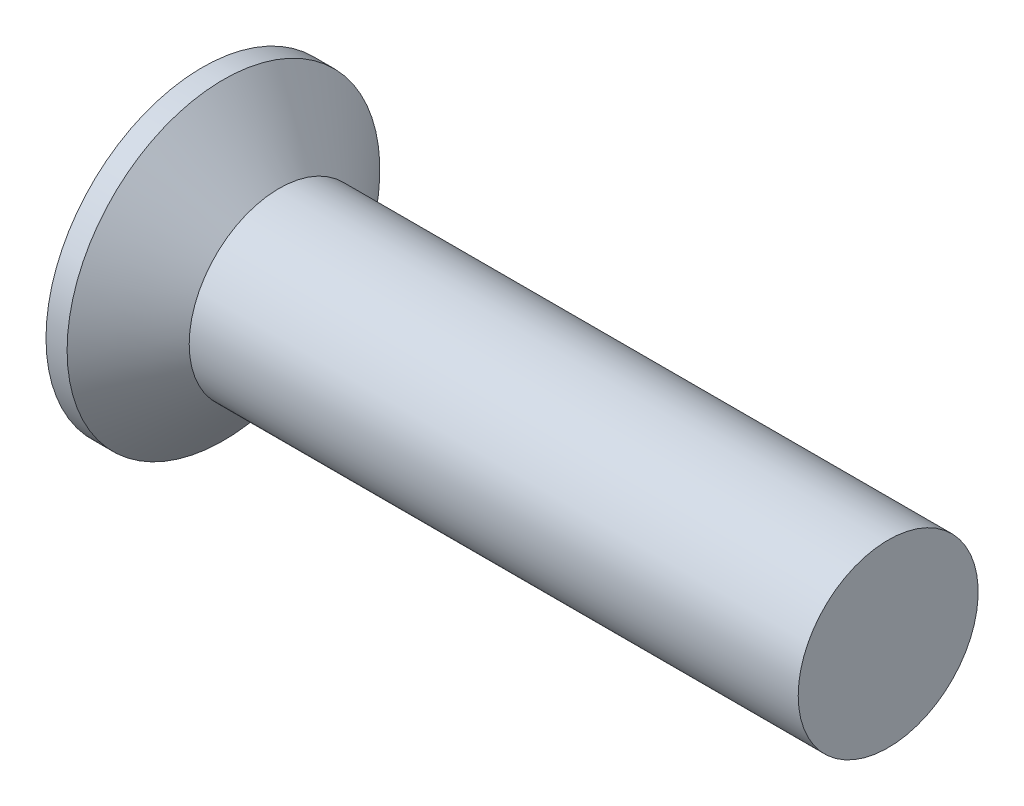
ISO-10303-21;
HEADER;
FILE_DESCRIPTION(('STEP AP214'),'2;1');
FILE_NAME('part.step','',(''),(''),'','','');
FILE_SCHEMA(('AUTOMOTIVE_DESIGN { 1 0 10303 214 1 1 1 1 }'));
ENDSEC;
DATA;
#1=APPLICATION_CONTEXT('core data for automotive mechanical design processes');
#2=APPLICATION_PROTOCOL_DEFINITION('international standard','automotive_design',2000,#1);
#3=PRODUCT_CONTEXT('',#1,'mechanical');
#4=PRODUCT('Part','Part','',(#3));
#5=PRODUCT_RELATED_PRODUCT_CATEGORY('part','',(#4));
#6=PRODUCT_DEFINITION_FORMATION('','',#4);
#7=PRODUCT_DEFINITION_CONTEXT('part definition',#1,'design');
#8=PRODUCT_DEFINITION('design','',#6,#7);
#9=PRODUCT_DEFINITION_SHAPE('','',#8);
#10=(LENGTH_UNIT() NAMED_UNIT(*) SI_UNIT(.MILLI.,.METRE.));
#11=(NAMED_UNIT(*) PLANE_ANGLE_UNIT() SI_UNIT($,.RADIAN.));
#12=(NAMED_UNIT(*) SI_UNIT($,.STERADIAN.) SOLID_ANGLE_UNIT());
#13=UNCERTAINTY_MEASURE_WITH_UNIT(LENGTH_MEASURE(1.E-05),#10,'distance_accuracy_value','');
#14=(GEOMETRIC_REPRESENTATION_CONTEXT(3) GLOBAL_UNCERTAINTY_ASSIGNED_CONTEXT((#13)) GLOBAL_UNIT_ASSIGNED_CONTEXT((#10,
#11,#12)) REPRESENTATION_CONTEXT('',''));
#15=CARTESIAN_POINT('',(0.,0.,0.));
#16=DIRECTION('',(0.,0.,1.));
#17=DIRECTION('',(1.,0.,0.));
#18=AXIS2_PLACEMENT_3D('',#15,#16,#17);
#19=CARTESIAN_POINT('',(0.,0.,0.));
#20=DIRECTION('',(-1.,0.,0.));
#21=DIRECTION('',(0.,0.,1.));
#22=AXIS2_PLACEMENT_3D('',#19,#20,#21);
#23=PLANE('',#22);
#24=CARTESIAN_POINT('',(0.,0.,0.));
#25=DIRECTION('',(-1.,0.,0.));
#26=DIRECTION('',(0.,0.,1.));
#27=AXIS2_PLACEMENT_3D('',#24,#25,#26);
#28=CIRCLE('',#27,3.6195);
#29=CARTESIAN_POINT('',(0.,0.,3.6195));
#30=VERTEX_POINT('',#29);
#31=EDGE_CURVE('E41',#30,#30,#28,.T.);
#32=ORIENTED_EDGE('',*,*,#31,.T.);
#33=EDGE_LOOP('',(#32));
#34=FACE_BOUND('',#33,.T.);
#35=DIRECTION('',(0.,1.,0.));
#36=VECTOR('',#35,1.);
#37=CARTESIAN_POINT('',(0.,-2.4257,-0.469899999999999));
#38=LINE('',#37,#36);
#39=CARTESIAN_POINT('',(0.,-2.4257,-0.469899999999999));
#40=VERTEX_POINT('',#39);
#41=CARTESIAN_POINT('',(0.,-0.469899999999998,-0.469899999999999));
#42=VERTEX_POINT('',#41);
#43=EDGE_CURVE('E102',#40,#42,#38,.T.);
#44=ORIENTED_EDGE('',*,*,#43,.T.);
#45=DIRECTION('',(0.,0.,-1.));
#46=VECTOR('',#45,1.);
#47=CARTESIAN_POINT('',(0.,-0.469900000000008,2.4257));
#48=LINE('',#47,#46);
#49=CARTESIAN_POINT('',(0.,-0.469899999999992,-2.4257));
#50=VERTEX_POINT('',#49);
#51=EDGE_CURVE('E82',#42,#50,#48,.T.);
#52=ORIENTED_EDGE('',*,*,#51,.T.);
#53=DIRECTION('',(0.,1.,0.));
#54=VECTOR('',#53,1.);
#55=CARTESIAN_POINT('',(0.,-0.469899999999992,-2.4257));
#56=LINE('',#55,#54);
#57=CARTESIAN_POINT('',(0.,0.469900000000008,-2.4257));
#58=VERTEX_POINT('',#57);
#59=EDGE_CURVE('E337',#50,#58,#56,.T.);
#60=ORIENTED_EDGE('',*,*,#59,.T.);
#61=DIRECTION('',(0.,0.,1.));
#62=VECTOR('',#61,1.);
#63=CARTESIAN_POINT('',(0.,0.469900000000008,-2.4257));
#64=LINE('',#63,#62);
#65=CARTESIAN_POINT('',(0.,0.469900000000001,-0.469899999999999));
#66=VERTEX_POINT('',#65);
#67=EDGE_CURVE('E98',#58,#66,#64,.T.);
#68=ORIENTED_EDGE('',*,*,#67,.T.);
#69=CARTESIAN_POINT('',(0.,2.4257,-0.469899999999999));
#70=VERTEX_POINT('',#69);
#71=EDGE_CURVE('E92',#66,#70,#38,.T.);
#72=ORIENTED_EDGE('',*,*,#71,.T.);
#73=DIRECTION('',(0.,0.,1.));
#74=VECTOR('',#73,1.);
#75=CARTESIAN_POINT('',(0.,2.4257,-0.469899999999999));
#76=LINE('',#75,#74);
#77=CARTESIAN_POINT('',(0.,2.4257,0.4699));
#78=VERTEX_POINT('',#77);
#79=EDGE_CURVE('E95',#70,#78,#76,.T.);
#80=ORIENTED_EDGE('',*,*,#79,.T.);
#81=DIRECTION('',(0.,-1.,0.));
#82=VECTOR('',#81,1.);
#83=CARTESIAN_POINT('',(0.,2.4257,0.4699));
#84=LINE('',#83,#82);
#85=CARTESIAN_POINT('',(0.,0.469899999999998,0.4699));
#86=VERTEX_POINT('',#85);
#87=EDGE_CURVE('E349',#78,#86,#84,.T.);
#88=ORIENTED_EDGE('',*,*,#87,.T.);
#89=CARTESIAN_POINT('',(0.,0.469899999999991,2.4257));
#90=VERTEX_POINT('',#89);
#91=EDGE_CURVE('E332',#86,#90,#64,.T.);
#92=ORIENTED_EDGE('',*,*,#91,.T.);
#93=DIRECTION('',(0.,-1.,0.));
#94=VECTOR('',#93,1.);
#95=CARTESIAN_POINT('',(0.,0.469899999999991,2.4257));
#96=LINE('',#95,#94);
#97=CARTESIAN_POINT('',(0.,-0.469900000000008,2.4257));
#98=VERTEX_POINT('',#97);
#99=EDGE_CURVE('E318',#90,#98,#96,.T.);
#100=ORIENTED_EDGE('',*,*,#99,.T.);
#101=CARTESIAN_POINT('',(0.,-0.469900000000001,0.4699));
#102=VERTEX_POINT('',#101);
#103=EDGE_CURVE('E330',#98,#102,#48,.T.);
#104=ORIENTED_EDGE('',*,*,#103,.T.);
#105=CARTESIAN_POINT('',(0.,-2.4257,0.4699));
#106=VERTEX_POINT('',#105);
#107=EDGE_CURVE('E108',#102,#106,#84,.T.);
#108=ORIENTED_EDGE('',*,*,#107,.T.);
#109=DIRECTION('',(0.,0.,-1.));
#110=VECTOR('',#109,1.);
#111=CARTESIAN_POINT('',(0.,-2.4257,0.4699));
#112=LINE('',#111,#110);
#113=EDGE_CURVE('E131',#106,#40,#112,.T.);
#114=ORIENTED_EDGE('',*,*,#113,.T.);
#115=EDGE_LOOP('',(#44,#52,#60,#68,#72,#80,#88,#92,#100,#104,#108,#114));
#116=FACE_BOUND('',#115,.T.);
#117=ADVANCED_FACE('F34',(#34,#116),#23,.T.);
#118=CARTESIAN_POINT('',(3.4873831884058,0.,0.209752463768116));
#119=DIRECTION('',(-0.0743900828817244,0.,-0.997229219171225));
#120=DIRECTION('',(-0.997229219171225,0.,0.0743900828817244));
#121=AXIS2_PLACEMENT_3D('',#118,#119,#120);
#122=PLANE('',#121);
#123=ORIENTED_EDGE('',*,*,#107,.F.);
#124=DIRECTION('',(0.994481343122547,0.0741851001926096,-0.0741851001926093));
#125=VECTOR('',#124,1.);
#126=CARTESIAN_POINT('',(3.50285782284413,-0.208598105957193,0.208598105957192));
#127=LINE('',#126,#125);
#128=CARTESIAN_POINT('',(3.1496,-0.234950000000001,0.23495));
#129=VERTEX_POINT('',#128);
#130=EDGE_CURVE('E126',#102,#129,#127,.T.);
#131=ORIENTED_EDGE('',*,*,#130,.T.);
#132=DIRECTION('',(0.81940388281906,0.56994826526729,-0.0611248864199703));
#133=VECTOR('',#132,1.);
#134=CARTESIAN_POINT('',(0.,-2.4257,0.4699));
#135=LINE('',#134,#133);
#136=EDGE_CURVE('E103',#106,#129,#135,.T.);
#137=ORIENTED_EDGE('',*,*,#136,.F.);
#138=EDGE_LOOP('',(#123,#131,#137));
#139=FACE_BOUND('',#138,.T.);
#140=ADVANCED_FACE('F154',(#139),#122,.T.);
#141=DIRECTION('',(0.81940388281906,-0.56994826526729,-0.0611248864199702));
#142=VECTOR('',#141,1.);
#143=CARTESIAN_POINT('',(0.,2.4257,0.4699));
#144=LINE('',#143,#142);
#145=CARTESIAN_POINT('',(3.1496,0.23495,0.23495));
#146=VERTEX_POINT('',#145);
#147=EDGE_CURVE('E48',#78,#146,#144,.T.);
#148=ORIENTED_EDGE('',*,*,#147,.T.);
#149=DIRECTION('',(-0.994481343122547,0.0741851001926089,0.0741851001926093));
#150=VECTOR('',#149,1.);
#151=CARTESIAN_POINT('',(3.50285782284413,0.208598105957191,0.208598105957192));
#152=LINE('',#151,#150);
#153=EDGE_CURVE('E345',#146,#86,#152,.T.);
#154=ORIENTED_EDGE('',*,*,#153,.T.);
#155=ORIENTED_EDGE('',*,*,#87,.F.);
#156=EDGE_LOOP('',(#148,#154,#155));
#157=FACE_BOUND('',#156,.T.);
#158=ADVANCED_FACE('F158',(#157),#122,.T.);
#159=CARTESIAN_POINT('',(3.4873831884058,0.,-0.209752463768116));
#160=DIRECTION('',(-0.0743900828817242,0.,0.997229219171224));
#161=DIRECTION('',(0.997229219171225,0.,0.0743900828817242));
#162=AXIS2_PLACEMENT_3D('',#159,#160,#161);
#163=PLANE('',#162);
#164=DIRECTION('',(0.819403882819061,0.56994826526729,0.0611248864199701));
#165=VECTOR('',#164,1.);
#166=CARTESIAN_POINT('',(0.,-2.4257,-0.469899999999999));
#167=LINE('',#166,#165);
#168=CARTESIAN_POINT('',(3.1496,-0.234949999999999,-0.234950000000001));
#169=VERTEX_POINT('',#168);
#170=EDGE_CURVE('E57',#40,#169,#167,.T.);
#171=ORIENTED_EDGE('',*,*,#170,.T.);
#172=DIRECTION('',(-0.994481343122547,-0.0741851001926091,-0.0741851001926092));
#173=VECTOR('',#172,1.);
#174=CARTESIAN_POINT('',(3.50285782284413,-0.208598105957191,-0.208598105957192));
#175=LINE('',#174,#173);
#176=EDGE_CURVE('E11',#169,#42,#175,.T.);
#177=ORIENTED_EDGE('',*,*,#176,.T.);
#178=ORIENTED_EDGE('',*,*,#43,.F.);
#179=EDGE_LOOP('',(#171,#177,#178));
#180=FACE_BOUND('',#179,.T.);
#181=ADVANCED_FACE('F151',(#180),#163,.T.);
#182=ORIENTED_EDGE('',*,*,#71,.F.);
#183=DIRECTION('',(0.994481343122547,-0.0741851001926094,0.0741851001926092));
#184=VECTOR('',#183,1.);
#185=CARTESIAN_POINT('',(3.50285782284413,0.208598105957193,-0.208598105957192));
#186=LINE('',#185,#184);
#187=CARTESIAN_POINT('',(3.1496,0.23495,-0.23495));
#188=VERTEX_POINT('',#187);
#189=EDGE_CURVE('E111',#66,#188,#186,.T.);
#190=ORIENTED_EDGE('',*,*,#189,.T.);
#191=DIRECTION('',(0.819403882819061,-0.56994826526729,0.0611248864199701));
#192=VECTOR('',#191,1.);
#193=CARTESIAN_POINT('',(0.,2.4257,-0.469899999999999));
#194=LINE('',#193,#192);
#195=EDGE_CURVE('E107',#70,#188,#194,.T.);
#196=ORIENTED_EDGE('',*,*,#195,.F.);
#197=EDGE_LOOP('',(#182,#190,#196));
#198=FACE_BOUND('',#197,.T.);
#199=ADVANCED_FACE('F110',(#198),#163,.T.);
#200=CARTESIAN_POINT('',(-6.34999999999999,0.,0.));
#201=DIRECTION('',(-1.,0.,0.));
#202=DIRECTION('',(0.,0.,1.));
#203=AXIS2_PLACEMENT_3D('',#200,#201,#202);
#204=CYLINDRICAL_SURFACE('',#203,3.6195);
#205=CARTESIAN_POINT('',(0.48855559676988,0.,0.));
#206=DIRECTION('',(-1.,0.,0.));
#207=DIRECTION('',(0.,0.,1.));
#208=AXIS2_PLACEMENT_3D('',#205,#206,#207);
#209=CIRCLE('',#208,3.6195);
#210=CARTESIAN_POINT('',(0.48855559676988,0.,3.6195));
#211=VERTEX_POINT('',#210);
#212=EDGE_CURVE('E134',#211,#211,#209,.T.);
#213=ORIENTED_EDGE('',*,*,#212,.T.);
#214=EDGE_LOOP('',(#213));
#215=FACE_BOUND('',#214,.T.);
#216=ORIENTED_EDGE('',*,*,#31,.F.);
#217=EDGE_LOOP('',(#216));
#218=FACE_BOUND('',#217,.T.);
#219=ADVANCED_FACE('F140',(#215,#218),#204,.T.);
#220=CARTESIAN_POINT('',(0.48855559676988,0.,0.));
#221=DIRECTION('',(-1.,0.,0.));
#222=DIRECTION('',(0.,0.,1.));
#223=AXIS2_PLACEMENT_3D('',#220,#221,#222);
#224=CONICAL_SURFACE('',#223,3.6195,0.872664625997167);
#225=CARTESIAN_POINT('',(1.778,0.,0.));
#226=DIRECTION('',(-1.,0.,0.));
#227=DIRECTION('',(0.,0.,1.));
#228=AXIS2_PLACEMENT_3D('',#225,#226,#227);
#229=CIRCLE('',#228,2.0828);
#230=CARTESIAN_POINT('',(1.778,0.,2.0828));
#231=VERTEX_POINT('',#230);
#232=EDGE_CURVE('E130',#231,#231,#229,.T.);
#233=ORIENTED_EDGE('',*,*,#232,.T.);
#234=EDGE_LOOP('',(#233));
#235=FACE_BOUND('',#234,.T.);
#236=ORIENTED_EDGE('',*,*,#212,.F.);
#237=EDGE_LOOP('',(#236));
#238=FACE_BOUND('',#237,.T.);
#239=ADVANCED_FACE('F142',(#235,#238),#224,.T.);
#240=CARTESIAN_POINT('',(-6.34999999999999,0.,0.));
#241=DIRECTION('',(-1.,0.,0.));
#242=DIRECTION('',(0.,0.,1.));
#243=AXIS2_PLACEMENT_3D('',#240,#241,#242);
#244=CYLINDRICAL_SURFACE('',#243,2.0828);
#245=CARTESIAN_POINT('',(15.875,0.,0.));
#246=DIRECTION('',(-1.,0.,0.));
#247=DIRECTION('',(0.,0.,1.));
#248=AXIS2_PLACEMENT_3D('',#245,#246,#247);
#249=CIRCLE('',#248,2.0828);
#250=CARTESIAN_POINT('',(15.875,0.,2.0828));
#251=VERTEX_POINT('',#250);
#252=EDGE_CURVE('E127',#251,#251,#249,.T.);
#253=ORIENTED_EDGE('',*,*,#252,.T.);
#254=EDGE_LOOP('',(#253));
#255=FACE_BOUND('',#254,.T.);
#256=ORIENTED_EDGE('',*,*,#232,.F.);
#257=EDGE_LOOP('',(#256));
#258=FACE_BOUND('',#257,.T.);
#259=ADVANCED_FACE('F148',(#255,#258),#244,.T.);
#260=CARTESIAN_POINT('',(15.875,2.0828,0.));
#261=DIRECTION('',(1.,0.,0.));
#262=DIRECTION('',(0.,0.,-1.));
#263=AXIS2_PLACEMENT_3D('',#260,#261,#262);
#264=PLANE('',#263);
#265=ORIENTED_EDGE('',*,*,#252,.F.);
#266=EDGE_LOOP('',(#265));
#267=FACE_BOUND('',#266,.T.);
#268=ADVANCED_FACE('F178',(#267),#264,.T.);
#269=CARTESIAN_POINT('',(3.1496,-0.23495,-0.23495));
#270=DIRECTION('',(-1.,0.,0.));
#271=DIRECTION('',(0.,0.,1.));
#272=AXIS2_PLACEMENT_3D('',#269,#270,#271);
#273=PLANE('',#272);
#274=DIRECTION('',(0.,1.,0.));
#275=VECTOR('',#274,1.);
#276=CARTESIAN_POINT('',(3.1496,-0.23495,-0.23495));
#277=LINE('',#276,#275);
#278=EDGE_CURVE('E122',#169,#188,#277,.T.);
#279=ORIENTED_EDGE('',*,*,#278,.F.);
#280=DIRECTION('',(0.,0.,-1.));
#281=VECTOR('',#280,1.);
#282=CARTESIAN_POINT('',(3.1496,-0.23495,0.23495));
#283=LINE('',#282,#281);
#284=EDGE_CURVE('E113',#129,#169,#283,.T.);
#285=ORIENTED_EDGE('',*,*,#284,.F.);
#286=DIRECTION('',(0.,-1.,0.));
#287=VECTOR('',#286,1.);
#288=CARTESIAN_POINT('',(3.1496,0.23495,0.23495));
#289=LINE('',#288,#287);
#290=EDGE_CURVE('E116',#146,#129,#289,.T.);
#291=ORIENTED_EDGE('',*,*,#290,.F.);
#292=DIRECTION('',(0.,0.,1.));
#293=VECTOR('',#292,1.);
#294=CARTESIAN_POINT('',(3.1496,0.23495,-0.23495));
#295=LINE('',#294,#293);
#296=EDGE_CURVE('E120',#188,#146,#295,.T.);
#297=ORIENTED_EDGE('',*,*,#296,.F.);
#298=EDGE_LOOP('',(#279,#285,#291,#297));
#299=FACE_BOUND('',#298,.T.);
#300=ADVANCED_FACE('F175',(#299),#273,.T.);
#301=CARTESIAN_POINT('',(0.,-2.4257,-0.469899999999999));
#302=DIRECTION('',(-0.571015993274934,0.820938935259036,0.));
#303=DIRECTION('',(-0.820938935259036,-0.571015993274934,0.));
#304=AXIS2_PLACEMENT_3D('',#301,#302,#303);
#305=PLANE('',#304);
#306=ORIENTED_EDGE('',*,*,#170,.F.);
#307=ORIENTED_EDGE('',*,*,#113,.F.);
#308=ORIENTED_EDGE('',*,*,#136,.T.);
#309=ORIENTED_EDGE('',*,*,#284,.T.);
#310=EDGE_LOOP('',(#306,#307,#308,#309));
#311=FACE_BOUND('',#310,.T.);
#312=ADVANCED_FACE('F167',(#311),#305,.T.);
#313=CARTESIAN_POINT('',(0.,2.4257,0.4699));
#314=DIRECTION('',(-0.571015993274934,-0.820938935259036,0.));
#315=DIRECTION('',(0.820938935259036,-0.571015993274934,0.));
#316=AXIS2_PLACEMENT_3D('',#313,#314,#315);
#317=PLANE('',#316);
#318=ORIENTED_EDGE('',*,*,#147,.F.);
#319=ORIENTED_EDGE('',*,*,#79,.F.);
#320=ORIENTED_EDGE('',*,*,#195,.T.);
#321=ORIENTED_EDGE('',*,*,#296,.T.);
#322=EDGE_LOOP('',(#318,#319,#320,#321));
#323=FACE_BOUND('',#322,.T.);
#324=ADVANCED_FACE('F106',(#323),#317,.T.);
#325=CARTESIAN_POINT('',(3.4873831884058,-0.209752463768116,0.));
#326=DIRECTION('',(-0.0743900828817244,0.997229219171225,0.));
#327=DIRECTION('',(-0.997229219171225,-0.0743900828817244,0.));
#328=AXIS2_PLACEMENT_3D('',#325,#326,#327);
#329=PLANE('',#328);
#330=DIRECTION('',(0.81940388281906,0.0611248864199683,0.56994826526729));
#331=VECTOR('',#330,1.);
#332=CARTESIAN_POINT('',(0.,-0.469899999999992,-2.4257));
#333=LINE('',#332,#331);
#334=EDGE_CURVE('E339',#50,#169,#333,.T.);
#335=ORIENTED_EDGE('',*,*,#334,.F.);
#336=ORIENTED_EDGE('',*,*,#51,.F.);
#337=ORIENTED_EDGE('',*,*,#176,.F.);
#338=EDGE_LOOP('',(#335,#336,#337));
#339=FACE_BOUND('',#338,.T.);
#340=ADVANCED_FACE('F174',(#339),#329,.T.);
#341=CARTESIAN_POINT('',(3.4873831884058,0.209752463768116,0.));
#342=DIRECTION('',(-0.0743900828817242,-0.997229219171224,0.));
#343=DIRECTION('',(0.997229219171225,-0.0743900828817242,0.));
#344=AXIS2_PLACEMENT_3D('',#341,#342,#343);
#345=PLANE('',#344);
#346=ORIENTED_EDGE('',*,*,#67,.F.);
#347=DIRECTION('',(0.819403882819061,-0.0611248864199721,0.56994826526729));
#348=VECTOR('',#347,1.);
#349=CARTESIAN_POINT('',(0.,0.469900000000008,-2.4257));
#350=LINE('',#349,#348);
#351=EDGE_CURVE('E73',#58,#188,#350,.T.);
#352=ORIENTED_EDGE('',*,*,#351,.T.);
#353=ORIENTED_EDGE('',*,*,#189,.F.);
#354=EDGE_LOOP('',(#346,#352,#353));
#355=FACE_BOUND('',#354,.T.);
#356=ADVANCED_FACE('F218',(#355),#345,.T.);
#357=CARTESIAN_POINT('',(0.,0.469900000000008,-2.4257));
#358=DIRECTION('',(-0.571015993274934,0.,0.820938935259036));
#359=DIRECTION('',(-0.820938935259036,0.,-0.571015993274934));
#360=AXIS2_PLACEMENT_3D('',#357,#358,#359);
#361=PLANE('',#360);
#362=ORIENTED_EDGE('',*,*,#351,.F.);
#363=ORIENTED_EDGE('',*,*,#59,.F.);
#364=ORIENTED_EDGE('',*,*,#334,.T.);
#365=ORIENTED_EDGE('',*,*,#278,.T.);
#366=EDGE_LOOP('',(#362,#363,#364,#365));
#367=FACE_BOUND('',#366,.T.);
#368=ADVANCED_FACE('F226',(#367),#361,.T.);
#369=ORIENTED_EDGE('',*,*,#103,.F.);
#370=DIRECTION('',(0.81940388281906,0.0611248864199722,-0.56994826526729));
#371=VECTOR('',#370,1.);
#372=CARTESIAN_POINT('',(0.,-0.469900000000008,2.4257));
#373=LINE('',#372,#371);
#374=EDGE_CURVE('E315',#98,#129,#373,.T.);
#375=ORIENTED_EDGE('',*,*,#374,.T.);
#376=ORIENTED_EDGE('',*,*,#130,.F.);
#377=EDGE_LOOP('',(#369,#375,#376));
#378=FACE_BOUND('',#377,.T.);
#379=ADVANCED_FACE('F220',(#378),#329,.T.);
#380=DIRECTION('',(0.819403882819061,-0.0611248864199681,-0.56994826526729));
#381=VECTOR('',#380,1.);
#382=CARTESIAN_POINT('',(0.,0.469899999999991,2.4257));
#383=LINE('',#382,#381);
#384=EDGE_CURVE('E326',#90,#146,#383,.T.);
#385=ORIENTED_EDGE('',*,*,#384,.F.);
#386=ORIENTED_EDGE('',*,*,#91,.F.);
#387=ORIENTED_EDGE('',*,*,#153,.F.);
#388=EDGE_LOOP('',(#385,#386,#387));
#389=FACE_BOUND('',#388,.T.);
#390=ADVANCED_FACE('F228',(#389),#345,.T.);
#391=CARTESIAN_POINT('',(0.,-0.469900000000008,2.4257));
#392=DIRECTION('',(-0.571015993274934,0.,-0.820938935259036));
#393=DIRECTION('',(0.820938935259036,0.,-0.571015993274934));
#394=AXIS2_PLACEMENT_3D('',#391,#392,#393);
#395=PLANE('',#394);
#396=ORIENTED_EDGE('',*,*,#374,.F.);
#397=ORIENTED_EDGE('',*,*,#99,.F.);
#398=ORIENTED_EDGE('',*,*,#384,.T.);
#399=ORIENTED_EDGE('',*,*,#290,.T.);
#400=EDGE_LOOP('',(#396,#397,#398,#399));
#401=FACE_BOUND('',#400,.T.);
#402=ADVANCED_FACE('F247',(#401),#395,.T.);
#403=CLOSED_SHELL('',(#117,#140,#158,#181,#199,#219,#239,#259,#268,#300,#312,#324,#340,#356,
#368,#379,#390,#402));
#404=MANIFOLD_SOLID_BREP('B2',#403);
#405=ADVANCED_BREP_SHAPE_REPRESENTATION('',(#18,#404),#14);
#406=SHAPE_DEFINITION_REPRESENTATION(#9,#405);
ENDSEC;
END-ISO-10303-21;
